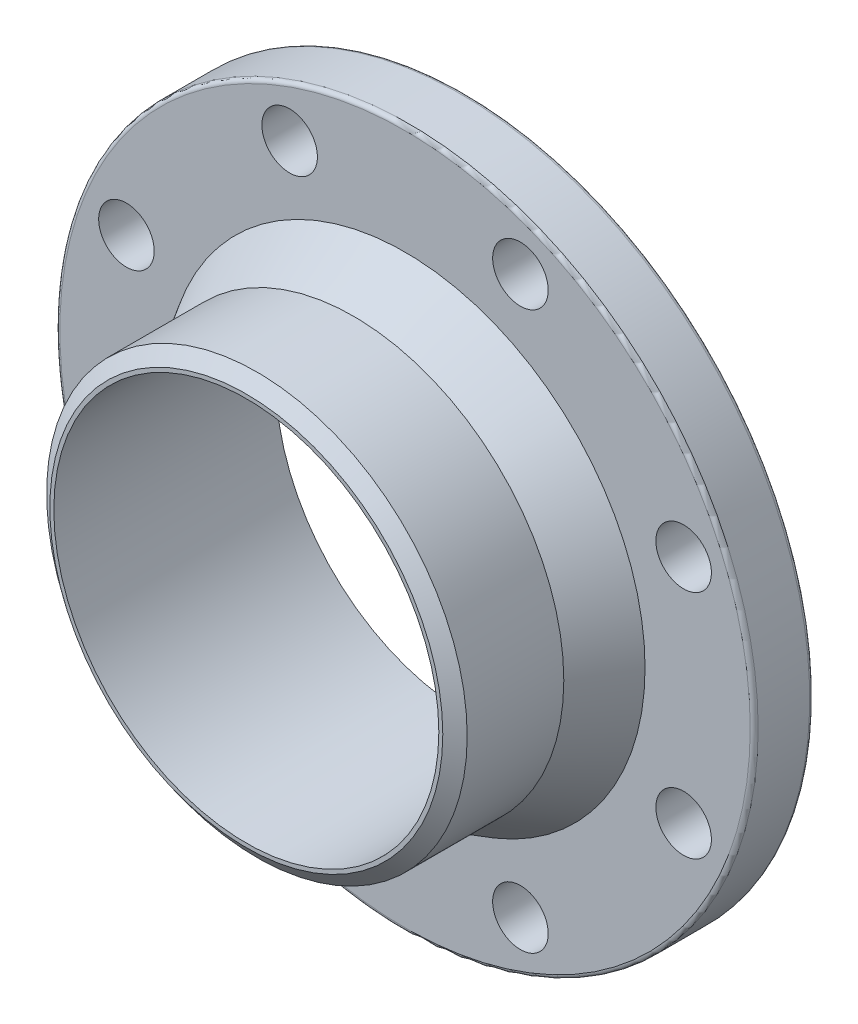
ISO-10303-21;
HEADER;
FILE_DESCRIPTION(('STEP AP214'),'2;1');
FILE_NAME('part.step','',(''),(''),'','','');
FILE_SCHEMA(('AUTOMOTIVE_DESIGN { 1 0 10303 214 1 1 1 1 }'));
ENDSEC;
DATA;
#1=APPLICATION_CONTEXT('core data for automotive mechanical design processes');
#2=APPLICATION_PROTOCOL_DEFINITION('international standard','automotive_design',2000,#1);
#3=PRODUCT_CONTEXT('',#1,'mechanical');
#4=PRODUCT('Part','Part','',(#3));
#5=PRODUCT_RELATED_PRODUCT_CATEGORY('part','',(#4));
#6=PRODUCT_DEFINITION_FORMATION('','',#4);
#7=PRODUCT_DEFINITION_CONTEXT('part definition',#1,'design');
#8=PRODUCT_DEFINITION('design','',#6,#7);
#9=PRODUCT_DEFINITION_SHAPE('','',#8);
#10=(LENGTH_UNIT() NAMED_UNIT(*) SI_UNIT(.MILLI.,.METRE.));
#11=(NAMED_UNIT(*) PLANE_ANGLE_UNIT() SI_UNIT($,.RADIAN.));
#12=(NAMED_UNIT(*) SI_UNIT($,.STERADIAN.) SOLID_ANGLE_UNIT());
#13=UNCERTAINTY_MEASURE_WITH_UNIT(LENGTH_MEASURE(1.E-05),#10,'distance_accuracy_value','');
#14=(GEOMETRIC_REPRESENTATION_CONTEXT(3) GLOBAL_UNCERTAINTY_ASSIGNED_CONTEXT((#13)) GLOBAL_UNIT_ASSIGNED_CONTEXT((#10,
#11,#12)) REPRESENTATION_CONTEXT('',''));
#15=CARTESIAN_POINT('',(0.,0.,0.));
#16=DIRECTION('',(0.,0.,1.));
#17=DIRECTION('',(1.,0.,0.));
#18=AXIS2_PLACEMENT_3D('',#15,#16,#17);
#19=CARTESIAN_POINT('',(0.,0.,0.));
#20=DIRECTION('',(0.,0.,1.));
#21=DIRECTION('',(1.,0.,0.));
#22=AXIS2_PLACEMENT_3D('',#19,#20,#21);
#23=PLANE('',#22);
#24=CARTESIAN_POINT('',(0.,0.,0.));
#25=DIRECTION('',(0.,0.,-1.));
#26=DIRECTION('',(-1.,0.,0.));
#27=AXIS2_PLACEMENT_3D('',#24,#25,#26);
#28=CIRCLE('',#27,107.95);
#29=CARTESIAN_POINT('',(-107.95,0.,0.));
#30=VERTEX_POINT('',#29);
#31=EDGE_CURVE('E105',#30,#30,#28,.T.);
#32=ORIENTED_EDGE('',*,*,#31,.T.);
#33=EDGE_LOOP('',(#32));
#34=FACE_BOUND('',#33,.T.);
#35=CARTESIAN_POINT('',(0.,0.,0.));
#36=DIRECTION('',(0.,0.,1.));
#37=DIRECTION('',(1.,0.,0.));
#38=AXIS2_PLACEMENT_3D('',#35,#36,#37);
#39=CIRCLE('',#38,77.0255);
#40=CARTESIAN_POINT('',(77.0255,0.,0.));
#41=VERTEX_POINT('',#40);
#42=EDGE_CURVE('E237',#41,#41,#39,.T.);
#43=ORIENTED_EDGE('',*,*,#42,.T.);
#44=EDGE_LOOP('',(#43));
#45=FACE_BOUND('',#44,.T.);
#46=ADVANCED_FACE('F43',(#34,#45),#23,.F.);
#47=CARTESIAN_POINT('',(0.,0.,88.9));
#48=DIRECTION('',(0.,0.,1.));
#49=DIRECTION('',(1.,0.,0.));
#50=AXIS2_PLACEMENT_3D('',#47,#48,#49);
#51=PLANE('',#50);
#52=CARTESIAN_POINT('',(0.,0.,88.9));
#53=DIRECTION('',(0.,0.,1.));
#54=DIRECTION('',(1.,0.,0.));
#55=AXIS2_PLACEMENT_3D('',#52,#53,#54);
#56=CIRCLE('',#55,78.6129999999083);
#57=CARTESIAN_POINT('',(78.6129999999083,0.,88.9));
#58=VERTEX_POINT('',#57);
#59=EDGE_CURVE('E120',#58,#58,#56,.T.);
#60=ORIENTED_EDGE('',*,*,#59,.T.);
#61=EDGE_LOOP('',(#60));
#62=FACE_BOUND('',#61,.T.);
#63=CARTESIAN_POINT('',(0.,0.,88.9));
#64=DIRECTION('',(0.,0.,1.));
#65=DIRECTION('',(1.,0.,0.));
#66=AXIS2_PLACEMENT_3D('',#63,#64,#65);
#67=CIRCLE('',#66,77.0255);
#68=CARTESIAN_POINT('',(77.0255,0.,88.9));
#69=VERTEX_POINT('',#68);
#70=EDGE_CURVE('E234',#69,#69,#67,.T.);
#71=ORIENTED_EDGE('',*,*,#70,.F.);
#72=EDGE_LOOP('',(#71));
#73=FACE_BOUND('',#72,.T.);
#74=ADVANCED_FACE('F216',(#62,#73),#51,.T.);
#75=CARTESIAN_POINT('',(0.,0.,25.4));
#76=DIRECTION('',(0.,0.,1.));
#77=DIRECTION('',(1.,0.,0.));
#78=AXIS2_PLACEMENT_3D('',#75,#76,#77);
#79=PLANE('',#78);
#80=CARTESIAN_POINT('',(0.,0.,25.4));
#81=DIRECTION('',(0.,0.,1.));
#82=DIRECTION('',(1.,0.,0.));
#83=AXIS2_PLACEMENT_3D('',#80,#81,#82);
#84=CIRCLE('',#83,138.1125);
#85=CARTESIAN_POINT('',(138.1125,0.,25.4));
#86=VERTEX_POINT('',#85);
#87=EDGE_CURVE('E140',#86,#86,#84,.T.);
#88=ORIENTED_EDGE('',*,*,#87,.T.);
#89=EDGE_LOOP('',(#88));
#90=FACE_BOUND('',#89,.T.);
#91=CARTESIAN_POINT('',(111.466065597486,46.1707561148494,25.4));
#92=DIRECTION('',(0.,0.,1.));
#93=DIRECTION('',(0.707106781186556,-0.707106781186539,0.));
#94=AXIS2_PLACEMENT_3D('',#91,#92,#93);
#95=CIRCLE('',#94,11.1125);
#96=CARTESIAN_POINT('',(119.323789703422,38.3130320089139,25.4));
#97=VERTEX_POINT('',#96);
#98=EDGE_CURVE('E179',#97,#97,#95,.T.);
#99=ORIENTED_EDGE('',*,*,#98,.F.);
#100=EDGE_LOOP('',(#99));
#101=FACE_BOUND('',#100,.T.);
#102=CARTESIAN_POINT('',(46.170756114849,-111.466065597486,25.4));
#103=DIRECTION('',(0.,0.,1.));
#104=DIRECTION('',(-0.707106781186541,-0.707106781186554,0.));
#105=AXIS2_PLACEMENT_3D('',#102,#103,#104);
#106=CIRCLE('',#105,11.1125);
#107=CARTESIAN_POINT('',(38.3130320089135,-119.323789703422,25.4));
#108=VERTEX_POINT('',#107);
#109=EDGE_CURVE('E187',#108,#108,#106,.T.);
#110=ORIENTED_EDGE('',*,*,#109,.F.);
#111=EDGE_LOOP('',(#110));
#112=FACE_BOUND('',#111,.T.);
#113=CARTESIAN_POINT('',(-111.466065597487,-46.1707561148486,25.4));
#114=DIRECTION('',(0.,0.,1.));
#115=DIRECTION('',(-0.707106781186551,0.707106781186544,0.));
#116=AXIS2_PLACEMENT_3D('',#113,#114,#115);
#117=CIRCLE('',#116,11.1125);
#118=CARTESIAN_POINT('',(-119.323789703422,-38.3130320089131,25.4));
#119=VERTEX_POINT('',#118);
#120=EDGE_CURVE('E195',#119,#119,#117,.T.);
#121=ORIENTED_EDGE('',*,*,#120,.F.);
#122=EDGE_LOOP('',(#121));
#123=FACE_BOUND('',#122,.T.);
#124=CARTESIAN_POINT('',(-46.1707561148482,111.466065597487,25.4));
#125=DIRECTION('',(0.,0.,1.));
#126=DIRECTION('',(0.707106781186546,0.707106781186549,0.));
#127=AXIS2_PLACEMENT_3D('',#124,#125,#126);
#128=CIRCLE('',#127,11.1125);
#129=CARTESIAN_POINT('',(-38.3130320089127,119.323789703422,25.4));
#130=VERTEX_POINT('',#129);
#131=EDGE_CURVE('E201',#130,#130,#128,.T.);
#132=ORIENTED_EDGE('',*,*,#131,.F.);
#133=EDGE_LOOP('',(#132));
#134=FACE_BOUND('',#133,.T.);
#135=CARTESIAN_POINT('',(46.1707561148481,111.466065597487,25.4));
#136=DIRECTION('',(0.,0.,1.));
#137=DIRECTION('',(1.,0.,0.));
#138=AXIS2_PLACEMENT_3D('',#135,#136,#137);
#139=CIRCLE('',#138,11.1125);
#140=CARTESIAN_POINT('',(57.2832561148482,111.466065597487,25.4));
#141=VERTEX_POINT('',#140);
#142=EDGE_CURVE('E118',#141,#141,#139,.T.);
#143=ORIENTED_EDGE('',*,*,#142,.F.);
#144=EDGE_LOOP('',(#143));
#145=FACE_BOUND('',#144,.T.);
#146=CARTESIAN_POINT('',(-111.466065597487,46.1707561148478,25.4));
#147=DIRECTION('',(0.,0.,1.));
#148=DIRECTION('',(0.,1.,0.));
#149=AXIS2_PLACEMENT_3D('',#146,#147,#148);
#150=CIRCLE('',#149,11.1125);
#151=CARTESIAN_POINT('',(-111.466065597487,57.2832561148478,25.4));
#152=VERTEX_POINT('',#151);
#153=EDGE_CURVE('E199',#152,#152,#150,.T.);
#154=ORIENTED_EDGE('',*,*,#153,.F.);
#155=EDGE_LOOP('',(#154));
#156=FACE_BOUND('',#155,.T.);
#157=CARTESIAN_POINT('',(-46.1707561148481,-111.466065597487,25.4));
#158=DIRECTION('',(0.,0.,1.));
#159=DIRECTION('',(-1.,0.,0.));
#160=AXIS2_PLACEMENT_3D('',#157,#158,#159);
#161=CIRCLE('',#160,11.1125);
#162=CARTESIAN_POINT('',(-57.2832561148482,-111.466065597487,25.4));
#163=VERTEX_POINT('',#162);
#164=EDGE_CURVE('E191',#163,#163,#161,.T.);
#165=ORIENTED_EDGE('',*,*,#164,.F.);
#166=EDGE_LOOP('',(#165));
#167=FACE_BOUND('',#166,.T.);
#168=CARTESIAN_POINT('',(111.466065597487,-46.170756114847,25.4));
#169=DIRECTION('',(0.,0.,1.));
#170=DIRECTION('',(0.,-1.,0.));
#171=AXIS2_PLACEMENT_3D('',#168,#169,#170);
#172=CIRCLE('',#171,11.1125);
#173=CARTESIAN_POINT('',(111.466065597487,-57.283256114847,25.4));
#174=VERTEX_POINT('',#173);
#175=EDGE_CURVE('E183',#174,#174,#172,.T.);
#176=ORIENTED_EDGE('',*,*,#175,.F.);
#177=EDGE_LOOP('',(#176));
#178=FACE_BOUND('',#177,.T.);
#179=CARTESIAN_POINT('',(0.,0.,25.4));
#180=DIRECTION('',(0.,0.,1.));
#181=DIRECTION('',(1.,0.,0.));
#182=AXIS2_PLACEMENT_3D('',#179,#180,#181);
#183=CIRCLE('',#182,96.0374);
#184=CARTESIAN_POINT('',(96.0374,0.,25.4));
#185=VERTEX_POINT('',#184);
#186=EDGE_CURVE('E114',#185,#185,#183,.T.);
#187=ORIENTED_EDGE('',*,*,#186,.F.);
#188=EDGE_LOOP('',(#187));
#189=FACE_BOUND('',#188,.T.);
#190=ADVANCED_FACE('F212',(#90,#101,#112,#123,#134,#145,#156,#167,#178,#189),#79,.T.);
#191=CARTESIAN_POINT('',(0.,0.,25.4));
#192=DIRECTION('',(0.,0.,-1.));
#193=DIRECTION('',(-1.,0.,0.));
#194=AXIS2_PLACEMENT_3D('',#191,#192,#193);
#195=CYLINDRICAL_SURFACE('',#194,139.7);
#196=CARTESIAN_POINT('',(0.,0.,3.175));
#197=DIRECTION('',(0.,0.,-1.));
#198=DIRECTION('',(-1.,0.,0.));
#199=AXIS2_PLACEMENT_3D('',#196,#197,#198);
#200=CIRCLE('',#199,139.7);
#201=CARTESIAN_POINT('',(-139.7,0.,3.175));
#202=VERTEX_POINT('',#201);
#203=EDGE_CURVE('E136',#202,#202,#200,.F.);
#204=ORIENTED_EDGE('',*,*,#203,.T.);
#205=EDGE_LOOP('',(#204));
#206=FACE_BOUND('',#205,.T.);
#207=CARTESIAN_POINT('',(0.,0.,23.8125));
#208=DIRECTION('',(0.,0.,1.));
#209=DIRECTION('',(1.,0.,0.));
#210=AXIS2_PLACEMENT_3D('',#207,#208,#209);
#211=CIRCLE('',#210,139.7);
#212=CARTESIAN_POINT('',(139.7,0.,23.8125));
#213=VERTEX_POINT('',#212);
#214=EDGE_CURVE('E132',#213,#213,#211,.F.);
#215=ORIENTED_EDGE('',*,*,#214,.T.);
#216=EDGE_LOOP('',(#215));
#217=FACE_BOUND('',#216,.T.);
#218=ADVANCED_FACE('F215',(#206,#217),#195,.T.);
#219=CARTESIAN_POINT('',(46.1707561148481,111.466065597487,25.4));
#220=DIRECTION('',(0.,0.,-1.));
#221=DIRECTION('',(-1.,0.,0.));
#222=AXIS2_PLACEMENT_3D('',#219,#220,#221);
#223=CYLINDRICAL_SURFACE('',#222,11.1125);
#224=ORIENTED_EDGE('',*,*,#142,.T.);
#225=EDGE_LOOP('',(#224));
#226=FACE_BOUND('',#225,.T.);
#227=CARTESIAN_POINT('',(46.1707561148481,111.466065597487,1.5875));
#228=DIRECTION('',(0.,0.,-1.));
#229=DIRECTION('',(-1.,0.,0.));
#230=AXIS2_PLACEMENT_3D('',#227,#228,#229);
#231=CIRCLE('',#230,11.1125);
#232=CARTESIAN_POINT('',(41.9181864726911,101.199454292455,1.5875));
#233=VERTEX_POINT('',#232);
#234=EDGE_CURVE('E177',#233,#233,#231,.T.);
#235=ORIENTED_EDGE('',*,*,#234,.T.);
#236=EDGE_LOOP('',(#235));
#237=FACE_BOUND('',#236,.T.);
#238=ADVANCED_FACE('F209',(#226,#237),#223,.F.);
#239=CARTESIAN_POINT('',(-46.1707561148482,111.466065597487,25.4));
#240=DIRECTION('',(0.,0.,-1.));
#241=DIRECTION('',(-1.,0.,0.));
#242=AXIS2_PLACEMENT_3D('',#239,#240,#241);
#243=CYLINDRICAL_SURFACE('',#242,11.1125);
#244=ORIENTED_EDGE('',*,*,#131,.T.);
#245=EDGE_LOOP('',(#244));
#246=FACE_BOUND('',#245,.T.);
#247=CARTESIAN_POINT('',(-46.1707561148482,111.466065597487,1.5875));
#248=DIRECTION('',(0.,0.,-1.));
#249=DIRECTION('',(-1.,0.,0.));
#250=AXIS2_PLACEMENT_3D('',#247,#248,#249);
#251=CIRCLE('',#250,11.1125);
#252=CARTESIAN_POINT('',(-41.9181864726911,101.199454292455,1.5875));
#253=VERTEX_POINT('',#252);
#254=EDGE_CURVE('E175',#253,#253,#251,.T.);
#255=ORIENTED_EDGE('',*,*,#254,.T.);
#256=EDGE_LOOP('',(#255));
#257=FACE_BOUND('',#256,.T.);
#258=ADVANCED_FACE('F283',(#246,#257),#243,.F.);
#259=CARTESIAN_POINT('',(-111.466065597487,46.1707561148478,25.4));
#260=DIRECTION('',(0.,0.,-1.));
#261=DIRECTION('',(-1.,0.,0.));
#262=AXIS2_PLACEMENT_3D('',#259,#260,#261);
#263=CYLINDRICAL_SURFACE('',#262,11.1125);
#264=ORIENTED_EDGE('',*,*,#153,.T.);
#265=EDGE_LOOP('',(#264));
#266=FACE_BOUND('',#265,.T.);
#267=CARTESIAN_POINT('',(-111.466065597487,46.1707561148478,1.5875));
#268=DIRECTION('',(0.,0.,-1.));
#269=DIRECTION('',(-1.,0.,0.));
#270=AXIS2_PLACEMENT_3D('',#267,#268,#269);
#271=CIRCLE('',#270,11.1125);
#272=CARTESIAN_POINT('',(-101.199454292455,41.9181864726907,1.5875));
#273=VERTEX_POINT('',#272);
#274=EDGE_CURVE('E171',#273,#273,#271,.T.);
#275=ORIENTED_EDGE('',*,*,#274,.T.);
#276=EDGE_LOOP('',(#275));
#277=FACE_BOUND('',#276,.T.);
#278=ADVANCED_FACE('F279',(#266,#277),#263,.F.);
#279=CARTESIAN_POINT('',(-111.466065597487,-46.1707561148486,25.4));
#280=DIRECTION('',(0.,0.,-1.));
#281=DIRECTION('',(-1.,0.,0.));
#282=AXIS2_PLACEMENT_3D('',#279,#280,#281);
#283=CYLINDRICAL_SURFACE('',#282,11.1125);
#284=ORIENTED_EDGE('',*,*,#120,.T.);
#285=EDGE_LOOP('',(#284));
#286=FACE_BOUND('',#285,.T.);
#287=CARTESIAN_POINT('',(-111.466065597487,-46.1707561148486,1.5875));
#288=DIRECTION('',(0.,0.,-1.));
#289=DIRECTION('',(-1.,0.,0.));
#290=AXIS2_PLACEMENT_3D('',#287,#288,#289);
#291=CIRCLE('',#290,11.1125);
#292=CARTESIAN_POINT('',(-101.199454292455,-41.9181864726915,1.5875));
#293=VERTEX_POINT('',#292);
#294=EDGE_CURVE('E165',#293,#293,#291,.T.);
#295=ORIENTED_EDGE('',*,*,#294,.T.);
#296=EDGE_LOOP('',(#295));
#297=FACE_BOUND('',#296,.T.);
#298=ADVANCED_FACE('F275',(#286,#297),#283,.F.);
#299=CARTESIAN_POINT('',(-46.1707561148481,-111.466065597487,25.4));
#300=DIRECTION('',(0.,0.,-1.));
#301=DIRECTION('',(-1.,0.,0.));
#302=AXIS2_PLACEMENT_3D('',#299,#300,#301);
#303=CYLINDRICAL_SURFACE('',#302,11.1125);
#304=ORIENTED_EDGE('',*,*,#164,.T.);
#305=EDGE_LOOP('',(#304));
#306=FACE_BOUND('',#305,.T.);
#307=CARTESIAN_POINT('',(-46.1707561148481,-111.466065597487,1.5875));
#308=DIRECTION('',(0.,0.,-1.));
#309=DIRECTION('',(-1.,0.,0.));
#310=AXIS2_PLACEMENT_3D('',#307,#308,#309);
#311=CIRCLE('',#310,11.1125);
#312=CARTESIAN_POINT('',(-41.9181864726911,-101.199454292455,1.5875));
#313=VERTEX_POINT('',#312);
#314=EDGE_CURVE('E160',#313,#313,#311,.T.);
#315=ORIENTED_EDGE('',*,*,#314,.T.);
#316=EDGE_LOOP('',(#315));
#317=FACE_BOUND('',#316,.T.);
#318=ADVANCED_FACE('F271',(#306,#317),#303,.F.);
#319=CARTESIAN_POINT('',(46.170756114849,-111.466065597486,25.4));
#320=DIRECTION('',(0.,0.,-1.));
#321=DIRECTION('',(-1.,0.,0.));
#322=AXIS2_PLACEMENT_3D('',#319,#320,#321);
#323=CYLINDRICAL_SURFACE('',#322,11.1125);
#324=ORIENTED_EDGE('',*,*,#109,.T.);
#325=EDGE_LOOP('',(#324));
#326=FACE_BOUND('',#325,.T.);
#327=CARTESIAN_POINT('',(46.170756114849,-111.466065597486,1.5875));
#328=DIRECTION('',(0.,0.,-1.));
#329=DIRECTION('',(-1.,0.,0.));
#330=AXIS2_PLACEMENT_3D('',#327,#328,#329);
#331=CIRCLE('',#330,11.1125);
#332=CARTESIAN_POINT('',(41.9181864726918,-101.199454292455,1.5875));
#333=VERTEX_POINT('',#332);
#334=EDGE_CURVE('E110',#333,#333,#331,.T.);
#335=ORIENTED_EDGE('',*,*,#334,.T.);
#336=EDGE_LOOP('',(#335));
#337=FACE_BOUND('',#336,.T.);
#338=ADVANCED_FACE('F163',(#326,#337),#323,.F.);
#339=CARTESIAN_POINT('',(111.466065597487,-46.170756114847,25.4));
#340=DIRECTION('',(0.,0.,-1.));
#341=DIRECTION('',(-1.,0.,0.));
#342=AXIS2_PLACEMENT_3D('',#339,#340,#341);
#343=CYLINDRICAL_SURFACE('',#342,11.1125);
#344=ORIENTED_EDGE('',*,*,#175,.T.);
#345=EDGE_LOOP('',(#344));
#346=FACE_BOUND('',#345,.T.);
#347=CARTESIAN_POINT('',(111.466065597487,-46.170756114847,1.5875));
#348=DIRECTION('',(0.,0.,-1.));
#349=DIRECTION('',(-1.,0.,0.));
#350=AXIS2_PLACEMENT_3D('',#347,#348,#349);
#351=CIRCLE('',#350,11.1125);
#352=CARTESIAN_POINT('',(101.199454292455,-41.91818647269,1.5875));
#353=VERTEX_POINT('',#352);
#354=EDGE_CURVE('E96',#353,#353,#351,.T.);
#355=ORIENTED_EDGE('',*,*,#354,.T.);
#356=EDGE_LOOP('',(#355));
#357=FACE_BOUND('',#356,.T.);
#358=ADVANCED_FACE('F264',(#346,#357),#343,.F.);
#359=CARTESIAN_POINT('',(111.466065597486,46.1707561148494,25.4));
#360=DIRECTION('',(0.,0.,-1.));
#361=DIRECTION('',(-1.,0.,0.));
#362=AXIS2_PLACEMENT_3D('',#359,#360,#361);
#363=CYLINDRICAL_SURFACE('',#362,11.1125);
#364=ORIENTED_EDGE('',*,*,#98,.T.);
#365=EDGE_LOOP('',(#364));
#366=FACE_BOUND('',#365,.T.);
#367=CARTESIAN_POINT('',(111.466065597486,46.1707561148494,1.5875));
#368=DIRECTION('',(0.,0.,-1.));
#369=DIRECTION('',(-1.,0.,0.));
#370=AXIS2_PLACEMENT_3D('',#367,#368,#369);
#371=CIRCLE('',#370,11.1125);
#372=CARTESIAN_POINT('',(101.199454292455,41.9181864726922,1.5875));
#373=VERTEX_POINT('',#372);
#374=EDGE_CURVE('E94',#373,#373,#371,.T.);
#375=ORIENTED_EDGE('',*,*,#374,.T.);
#376=EDGE_LOOP('',(#375));
#377=FACE_BOUND('',#376,.T.);
#378=ADVANCED_FACE('F103',(#366,#377),#363,.F.);
#379=CARTESIAN_POINT('',(0.,0.,1.5875));
#380=DIRECTION('',(0.,0.,-1.));
#381=DIRECTION('',(-1.,0.,0.));
#382=AXIS2_PLACEMENT_3D('',#379,#380,#381);
#383=PLANE('',#382);
#384=CARTESIAN_POINT('',(0.,0.,1.5875));
#385=DIRECTION('',(0.,0.,-1.));
#386=DIRECTION('',(-1.,0.,0.));
#387=AXIS2_PLACEMENT_3D('',#384,#385,#386);
#388=CIRCLE('',#387,138.1125);
#389=CARTESIAN_POINT('',(-138.1125,0.,1.5875));
#390=VERTEX_POINT('',#389);
#391=EDGE_CURVE('E128',#390,#390,#388,.T.);
#392=ORIENTED_EDGE('',*,*,#391,.T.);
#393=EDGE_LOOP('',(#392));
#394=FACE_BOUND('',#393,.T.);
#395=ORIENTED_EDGE('',*,*,#294,.F.);
#396=CARTESIAN_POINT('',(0.,0.,1.5875));
#397=DIRECTION('',(0.,0.,-1.));
#398=DIRECTION('',(-1.,0.,0.));
#399=AXIS2_PLACEMENT_3D('',#396,#397,#398);
#400=CIRCLE('',#399,109.5375);
#401=EDGE_CURVE('E12',#293,#313,#400,.F.);
#402=ORIENTED_EDGE('',*,*,#401,.T.);
#403=ORIENTED_EDGE('',*,*,#314,.F.);
#404=CARTESIAN_POINT('',(0.,0.,1.5875));
#405=DIRECTION('',(0.,0.,-1.));
#406=DIRECTION('',(-1.,0.,0.));
#407=AXIS2_PLACEMENT_3D('',#404,#405,#406);
#408=CIRCLE('',#407,109.5375);
#409=EDGE_CURVE('E52',#313,#333,#408,.F.);
#410=ORIENTED_EDGE('',*,*,#409,.T.);
#411=ORIENTED_EDGE('',*,*,#334,.F.);
#412=CARTESIAN_POINT('',(0.,0.,1.5875));
#413=DIRECTION('',(0.,0.,-1.));
#414=DIRECTION('',(-1.,0.,0.));
#415=AXIS2_PLACEMENT_3D('',#412,#413,#414);
#416=CIRCLE('',#415,109.5375);
#417=EDGE_CURVE('E100',#333,#353,#416,.F.);
#418=ORIENTED_EDGE('',*,*,#417,.T.);
#419=ORIENTED_EDGE('',*,*,#354,.F.);
#420=CARTESIAN_POINT('',(0.,0.,1.5875));
#421=DIRECTION('',(0.,0.,-1.));
#422=DIRECTION('',(-1.,0.,0.));
#423=AXIS2_PLACEMENT_3D('',#420,#421,#422);
#424=CIRCLE('',#423,109.5375);
#425=EDGE_CURVE('E90',#353,#373,#424,.F.);
#426=ORIENTED_EDGE('',*,*,#425,.T.);
#427=ORIENTED_EDGE('',*,*,#374,.F.);
#428=CARTESIAN_POINT('',(0.,0.,1.5875));
#429=DIRECTION('',(0.,0.,-1.));
#430=DIRECTION('',(-1.,0.,0.));
#431=AXIS2_PLACEMENT_3D('',#428,#429,#430);
#432=CIRCLE('',#431,109.5375);
#433=EDGE_CURVE('E62',#373,#233,#432,.F.);
#434=ORIENTED_EDGE('',*,*,#433,.T.);
#435=ORIENTED_EDGE('',*,*,#234,.F.);
#436=CARTESIAN_POINT('',(0.,0.,1.5875));
#437=DIRECTION('',(0.,0.,-1.));
#438=DIRECTION('',(-1.,0.,0.));
#439=AXIS2_PLACEMENT_3D('',#436,#437,#438);
#440=CIRCLE('',#439,109.5375);
#441=EDGE_CURVE('E68',#233,#253,#440,.F.);
#442=ORIENTED_EDGE('',*,*,#441,.T.);
#443=ORIENTED_EDGE('',*,*,#254,.F.);
#444=CARTESIAN_POINT('',(0.,0.,1.5875));
#445=DIRECTION('',(0.,0.,-1.));
#446=DIRECTION('',(-1.,0.,0.));
#447=AXIS2_PLACEMENT_3D('',#444,#445,#446);
#448=CIRCLE('',#447,109.5375);
#449=EDGE_CURVE('E146',#253,#273,#448,.F.);
#450=ORIENTED_EDGE('',*,*,#449,.T.);
#451=ORIENTED_EDGE('',*,*,#274,.F.);
#452=CARTESIAN_POINT('',(0.,0.,1.5875));
#453=DIRECTION('',(0.,0.,-1.));
#454=DIRECTION('',(-1.,0.,0.));
#455=AXIS2_PLACEMENT_3D('',#452,#453,#454);
#456=CIRCLE('',#455,109.5375);
#457=EDGE_CURVE('E143',#273,#293,#456,.F.);
#458=ORIENTED_EDGE('',*,*,#457,.T.);
#459=EDGE_LOOP('',(#395,#402,#403,#410,#411,#418,#419,#426,#427,#434,#435,#442,#443,#450,#451,#458));
#460=FACE_BOUND('',#459,.T.);
#461=ADVANCED_FACE('F93',(#394,#460),#383,.T.);
#462=CARTESIAN_POINT('',(0.,0.,25.4));
#463=DIRECTION('',(0.,0.,-1.));
#464=DIRECTION('',(1.,0.,0.));
#465=AXIS2_PLACEMENT_3D('',#462,#463,#464);
#466=CONICAL_SURFACE('',#465,96.0374,0.5235987755983);
#467=CARTESIAN_POINT('',(0.,0.,46.0112314049888));
#468=DIRECTION('',(0.,0.,-1.));
#469=DIRECTION('',(-1.,0.,0.));
#470=AXIS2_PLACEMENT_3D('',#467,#468,#469);
#471=CIRCLE('',#470,84.1375);
#472=CARTESIAN_POINT('',(84.1375,0.,46.011231405032));
#473=VERTEX_POINT('',#472);
#474=EDGE_CURVE('E229',#473,#473,#471,.F.);
#475=ORIENTED_EDGE('',*,*,#474,.F.);
#476=EDGE_LOOP('',(#475));
#477=FACE_BOUND('',#476,.T.);
#478=ORIENTED_EDGE('',*,*,#186,.T.);
#479=EDGE_LOOP('',(#478));
#480=FACE_BOUND('',#479,.T.);
#481=ADVANCED_FACE('F257',(#477,#480),#466,.T.);
#482=CARTESIAN_POINT('',(0.,0.,-500000.));
#483=DIRECTION('',(0.,0.,1.));
#484=DIRECTION('',(1.,0.,0.));
#485=AXIS2_PLACEMENT_3D('',#482,#483,#484);
#486=CYLINDRICAL_SURFACE('',#485,84.1375);
#487=CARTESIAN_POINT('',(0.,0.,84.660902054793));
#488=DIRECTION('',(0.,0.,1.));
#489=DIRECTION('',(1.,0.,0.));
#490=AXIS2_PLACEMENT_3D('',#487,#488,#489);
#491=CIRCLE('',#490,84.1375);
#492=CARTESIAN_POINT('',(84.1375,0.,84.660902054793));
#493=VERTEX_POINT('',#492);
#494=EDGE_CURVE('E124',#493,#493,#491,.F.);
#495=CARTESIAN_POINT('',(84.1375,0.,84.660902054793));
#496=CARTESIAN_POINT('',(84.1375,0.,84.2583013188497));
#497=CARTESIAN_POINT('',(84.1375,0.,83.8557005829064));
#498=CARTESIAN_POINT('',(84.1375,0.,83.0504991110388));
#499=CARTESIAN_POINT('',(84.1375,0.,82.6478983751144));
#500=CARTESIAN_POINT('',(84.1375,0.,81.8426969032468));
#501=CARTESIAN_POINT('',(84.1375,0.,81.4400961673035));
#502=CARTESIAN_POINT('',(84.1375,0.,80.6348946954358));
#503=CARTESIAN_POINT('',(84.1375,0.,80.2322939595115));
#504=CARTESIAN_POINT('',(84.1375,0.,79.4270924876438));
#505=CARTESIAN_POINT('',(84.1375,0.,79.0244917517005));
#506=CARTESIAN_POINT('',(84.1375,0.,78.2192902798329));
#507=CARTESIAN_POINT('',(84.1375,0.,77.8166895439085));
#508=CARTESIAN_POINT('',(84.1375,0.,77.0114880720409));
#509=CARTESIAN_POINT('',(84.1375,0.,76.6088873360976));
#510=CARTESIAN_POINT('',(84.1375,0.,75.8036858642299));
#511=CARTESIAN_POINT('',(84.1375,0.,75.4010851283056));
#512=CARTESIAN_POINT('',(84.1375,0.,74.5958836564379));
#513=CARTESIAN_POINT('',(84.1375,0.,74.1932829204946));
#514=CARTESIAN_POINT('',(84.1375,0.,73.388081448608));
#515=CARTESIAN_POINT('',(84.1375,0.,72.9854807126647));
#516=CARTESIAN_POINT('',(84.1375,0.,72.1802792407971));
#517=CARTESIAN_POINT('',(84.1375,0.,71.7776785048727));
#518=CARTESIAN_POINT('',(84.1375,0.,70.9724770330051));
#519=CARTESIAN_POINT('',(84.1375,0.,70.5698762970618));
#520=CARTESIAN_POINT('',(84.1375,0.,69.7646748251941));
#521=CARTESIAN_POINT('',(84.1375,0.,69.3620740892698));
#522=CARTESIAN_POINT('',(84.1375,0.,68.5568726174021));
#523=CARTESIAN_POINT('',(84.1375,0.,68.1542718814588));
#524=CARTESIAN_POINT('',(84.1375,0.,67.3490704095911));
#525=CARTESIAN_POINT('',(84.1375,0.,66.9464696736668));
#526=CARTESIAN_POINT('',(84.1375,0.,66.1412682017992));
#527=CARTESIAN_POINT('',(84.1375,0.,65.7386674658558));
#528=CARTESIAN_POINT('',(84.1375,0.,64.9334659939693));
#529=CARTESIAN_POINT('',(84.1375,0.,64.5308652580259));
#530=CARTESIAN_POINT('',(84.1375,0.,63.7256637861583));
#531=CARTESIAN_POINT('',(84.1375,0.,63.3230630502339));
#532=CARTESIAN_POINT('',(84.1375,0.,62.5178615783663));
#533=CARTESIAN_POINT('',(84.1375,0.,62.115260842423));
#534=CARTESIAN_POINT('',(84.1375,0.,61.3100593705553));
#535=CARTESIAN_POINT('',(84.1375,0.,60.907458634631));
#536=CARTESIAN_POINT('',(84.1375,0.,60.1022571627633));
#537=CARTESIAN_POINT('',(84.1375,0.,59.69965642682));
#538=CARTESIAN_POINT('',(84.1375,0.,58.8944549549524));
#539=CARTESIAN_POINT('',(84.1375,0.,58.491854219028));
#540=CARTESIAN_POINT('',(84.1375,0.,57.6866527471604));
#541=CARTESIAN_POINT('',(84.1375,0.,57.2840520112171));
#542=CARTESIAN_POINT('',(84.1375,0.,56.4788505393305));
#543=CARTESIAN_POINT('',(84.1375,0.,56.0762498033872));
#544=CARTESIAN_POINT('',(84.1375,0.,55.2710483315195));
#545=CARTESIAN_POINT('',(84.1375,0.,54.8684475955952));
#546=CARTESIAN_POINT('',(84.1375,0.,54.0632461237275));
#547=CARTESIAN_POINT('',(84.1375,0.,53.6606453877842));
#548=CARTESIAN_POINT('',(84.1375,0.,52.8554439159166));
#549=CARTESIAN_POINT('',(84.1375,0.,52.4528431799922));
#550=CARTESIAN_POINT('',(84.1375,0.,51.6476417081246));
#551=CARTESIAN_POINT('',(84.1375,0.,51.2450409721813));
#552=CARTESIAN_POINT('',(84.1375,0.,50.4398395003136));
#553=CARTESIAN_POINT('',(84.1375,0.,50.0372387643893));
#554=CARTESIAN_POINT('',(84.1375,0.,49.2320372925216));
#555=CARTESIAN_POINT('',(84.1375,0.,48.8294365565783));
#556=CARTESIAN_POINT('',(84.1375,0.,48.0242350847107));
#557=CARTESIAN_POINT('',(84.1375,0.,47.6216343487863));
#558=CARTESIAN_POINT('',(84.1375,0.,46.8164328769186));
#559=CARTESIAN_POINT('',(84.1375,0.,46.4138321409754));
#560=CARTESIAN_POINT('',(84.1375,0.,46.011231405032));
#561=B_SPLINE_CURVE_WITH_KNOTS('',3,(#495,#496,#497,#498,#499,#500,#501,#502,#503,#504,#505,
#506,#507,#508,#509,#510,#511,#512,#513,#514,#515,#516,#517,#518,#519,#520,#521,#522,#523,#524,
#525,#526,#527,#528,#529,#530,#531,#532,#533,#534,#535,#536,#537,#538,#539,#540,#541,#542,#543,
#544,#545,#546,#547,#548,#549,#550,#551,#552,#553,#554,#555,#556,#557,#558,#559,#560),
.UNSPECIFIED.,.F.,.F.,(4,2,2,2,2,2,2,2,2,2,2,2,2,2,2,2,2,2,2,2,2,2,2,2,2,2,2,2,2,2,2,2,4),(0.,
1.2078022078299,2.41560441560296,3.62340662343286,4.83120883120591,6.03901103903581,
7.24681324680887,8.45461545463877,9.66241766241183,10.8702198702417,12.0780220780716,
13.2858242858447,14.4936264936746,15.7014287014476,16.9092309092775,18.1170331170506,
19.3248353248805,20.5326375327104,21.7404397404835,22.9482419483134,24.1560441560864,
25.3638463639163,26.5716485716894,27.7794507795193,28.9872529873492,30.1950551951222,
31.4028574029521,32.6106596107252,33.8184618185551,35.0262640263281,36.234066234158,
37.4418684419311,38.649670649761),.UNSPECIFIED.);
#562=EDGE_CURVE('BSEAM295',#493,#473,#561,.T.);
#563=ORIENTED_EDGE('',*,*,#494,.T.);
#564=ORIENTED_EDGE('',*,*,#474,.T.);
#565=ORIENTED_EDGE('',*,*,#562,.T.);
#566=ORIENTED_EDGE('',*,*,#562,.F.);
#567=EDGE_LOOP('',(#563,#565,#564,#566));
#568=FACE_BOUND('',#567,.T.);
#569=ADVANCED_FACE('F295',(#568),#486,.T.);
#570=CARTESIAN_POINT('',(0.,0.,88.9000000000237));
#571=DIRECTION('',(0.,0.,-1.));
#572=DIRECTION('',(-1.,0.,0.));
#573=AXIS2_PLACEMENT_3D('',#570,#571,#572);
#574=CONICAL_SURFACE('',#573,78.6129999998774,0.916297857291687);
#575=ORIENTED_EDGE('',*,*,#494,.F.);
#576=EDGE_LOOP('',(#575));
#577=FACE_BOUND('',#576,.T.);
#578=ORIENTED_EDGE('',*,*,#59,.F.);
#579=EDGE_LOOP('',(#578));
#580=FACE_BOUND('',#579,.T.);
#581=ADVANCED_FACE('F292',(#577,#580),#574,.T.);
#582=CARTESIAN_POINT('',(0.,0.,88.9));
#583=DIRECTION('',(0.,0.,-1.));
#584=DIRECTION('',(-1.,0.,0.));
#585=AXIS2_PLACEMENT_3D('',#582,#583,#584);
#586=CYLINDRICAL_SURFACE('',#585,77.0255);
#587=ORIENTED_EDGE('',*,*,#70,.T.);
#588=EDGE_LOOP('',(#587));
#589=FACE_BOUND('',#588,.T.);
#590=ORIENTED_EDGE('',*,*,#42,.F.);
#591=EDGE_LOOP('',(#590));
#592=FACE_BOUND('',#591,.T.);
#593=ADVANCED_FACE('F244',(#589,#592),#586,.F.);
#594=CARTESIAN_POINT('',(0.,0.,3.175));
#595=DIRECTION('',(0.,0.,-1.));
#596=DIRECTION('',(-1.,0.,0.));
#597=AXIS2_PLACEMENT_3D('',#594,#595,#596);
#598=TOROIDAL_SURFACE('',#597,138.1125,1.5875);
#599=ORIENTED_EDGE('',*,*,#203,.F.);
#600=EDGE_LOOP('',(#599));
#601=FACE_BOUND('',#600,.T.);
#602=ORIENTED_EDGE('',*,*,#391,.F.);
#603=EDGE_LOOP('',(#602));
#604=FACE_BOUND('',#603,.T.);
#605=ADVANCED_FACE('F297',(#601,#604),#598,.T.);
#606=CARTESIAN_POINT('',(0.,0.,23.8125));
#607=DIRECTION('',(0.,0.,1.));
#608=DIRECTION('',(1.,0.,0.));
#609=AXIS2_PLACEMENT_3D('',#606,#607,#608);
#610=TOROIDAL_SURFACE('',#609,138.1125,1.5875);
#611=ORIENTED_EDGE('',*,*,#214,.F.);
#612=EDGE_LOOP('',(#611));
#613=FACE_BOUND('',#612,.T.);
#614=ORIENTED_EDGE('',*,*,#87,.F.);
#615=EDGE_LOOP('',(#614));
#616=FACE_BOUND('',#615,.T.);
#617=ADVANCED_FACE('F299',(#613,#616),#610,.T.);
#618=CARTESIAN_POINT('',(0.,0.,0.));
#619=DIRECTION('',(0.,0.,-1.));
#620=DIRECTION('',(-1.,0.,0.));
#621=AXIS2_PLACEMENT_3D('',#618,#619,#620);
#622=TOROIDAL_SURFACE('',#621,109.5375,1.5875);
#623=ORIENTED_EDGE('',*,*,#409,.F.);
#624=ORIENTED_EDGE('',*,*,#401,.F.);
#625=ORIENTED_EDGE('',*,*,#457,.F.);
#626=ORIENTED_EDGE('',*,*,#449,.F.);
#627=ORIENTED_EDGE('',*,*,#441,.F.);
#628=ORIENTED_EDGE('',*,*,#433,.F.);
#629=ORIENTED_EDGE('',*,*,#425,.F.);
#630=ORIENTED_EDGE('',*,*,#417,.F.);
#631=EDGE_LOOP('',(#623,#624,#625,#626,#627,#628,#629,#630));
#632=FACE_BOUND('',#631,.T.);
#633=ORIENTED_EDGE('',*,*,#31,.F.);
#634=EDGE_LOOP('',(#633));
#635=FACE_BOUND('',#634,.T.);
#636=ADVANCED_FACE('F45',(#632,#635),#622,.F.);
#637=CLOSED_SHELL('',(#46,#74,#190,#218,#238,#258,#278,#298,#318,#338,#358,#378,#461,#481,#569,
#581,#593,#605,#617,#636));
#638=MANIFOLD_SOLID_BREP('B2',#637);
#639=ADVANCED_BREP_SHAPE_REPRESENTATION('',(#18,#638),#14);
#640=SHAPE_DEFINITION_REPRESENTATION(#9,#639);
ENDSEC;
END-ISO-10303-21;
